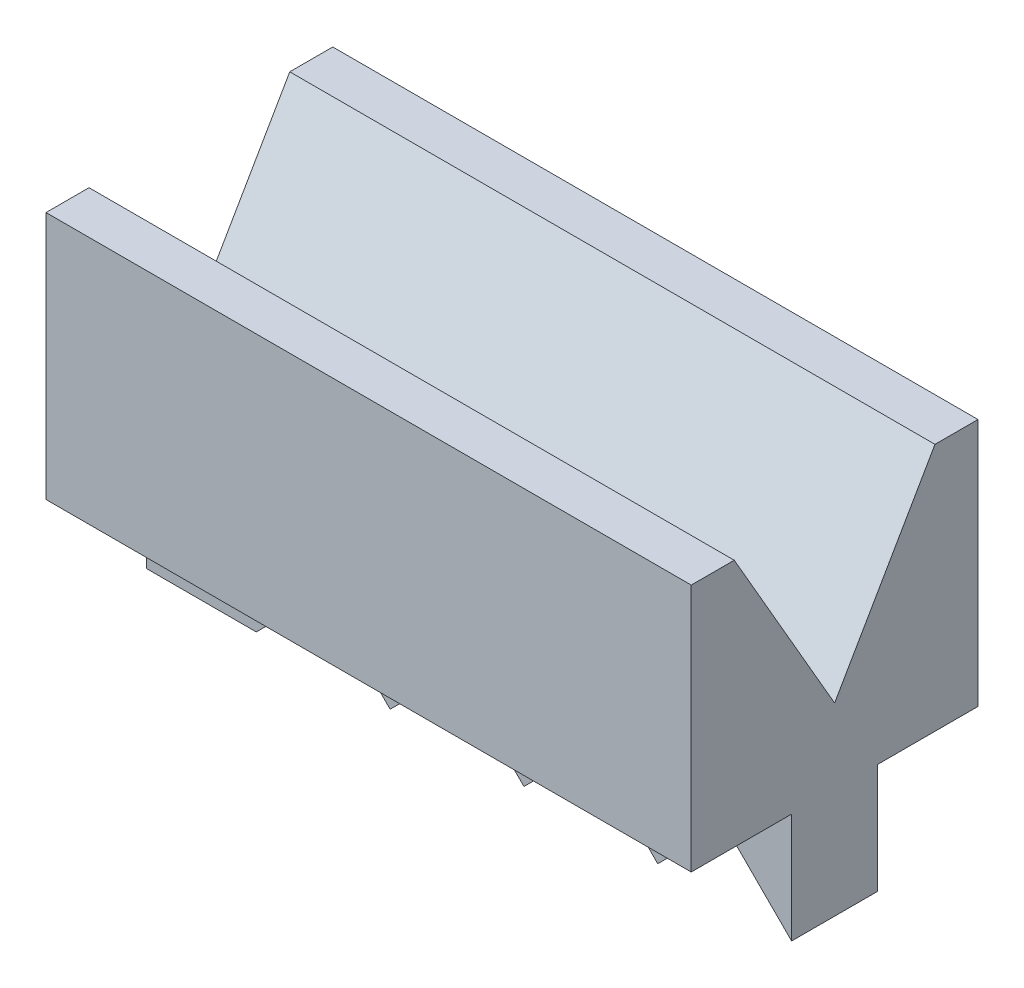
ISO-10303-21;
HEADER;
FILE_DESCRIPTION(('STEP AP214'),'2;1');
FILE_NAME('part.step','',(''),(''),'','','');
FILE_SCHEMA(('AUTOMOTIVE_DESIGN { 1 0 10303 214 1 1 1 1 }'));
ENDSEC;
DATA;
#1=APPLICATION_CONTEXT('core data for automotive mechanical design processes');
#2=APPLICATION_PROTOCOL_DEFINITION('international standard','automotive_design',2000,#1);
#3=PRODUCT_CONTEXT('',#1,'mechanical');
#4=PRODUCT('Part','Part','',(#3));
#5=PRODUCT_RELATED_PRODUCT_CATEGORY('part','',(#4));
#6=PRODUCT_DEFINITION_FORMATION('','',#4);
#7=PRODUCT_DEFINITION_CONTEXT('part definition',#1,'design');
#8=PRODUCT_DEFINITION('design','',#6,#7);
#9=PRODUCT_DEFINITION_SHAPE('','',#8);
#10=(LENGTH_UNIT() NAMED_UNIT(*) SI_UNIT(.MILLI.,.METRE.));
#11=(NAMED_UNIT(*) PLANE_ANGLE_UNIT() SI_UNIT($,.RADIAN.));
#12=(NAMED_UNIT(*) SI_UNIT($,.STERADIAN.) SOLID_ANGLE_UNIT());
#13=UNCERTAINTY_MEASURE_WITH_UNIT(LENGTH_MEASURE(1.E-05),#10,'distance_accuracy_value','');
#14=(GEOMETRIC_REPRESENTATION_CONTEXT(3) GLOBAL_UNCERTAINTY_ASSIGNED_CONTEXT((#13)) GLOBAL_UNIT_ASSIGNED_CONTEXT((#10,
#11,#12)) REPRESENTATION_CONTEXT('',''));
#15=CARTESIAN_POINT('',(0.,0.,0.));
#16=DIRECTION('',(0.,0.,1.));
#17=DIRECTION('',(1.,0.,0.));
#18=AXIS2_PLACEMENT_3D('',#15,#16,#17);
#19=CARTESIAN_POINT('',(135.,-23.,-9.));
#20=DIRECTION('',(0.,1.,0.));
#21=DIRECTION('',(0.,0.,1.));
#22=AXIS2_PLACEMENT_3D('',#19,#20,#21);
#23=PLANE('',#22);
#24=DIRECTION('',(0.,0.,-1.));
#25=VECTOR('',#24,1.);
#26=CARTESIAN_POINT('',(23.,-23.,30.001));
#27=LINE('',#26,#25);
#28=CARTESIAN_POINT('',(23.,-23.,9.));
#29=VERTEX_POINT('',#28);
#30=CARTESIAN_POINT('',(23.,-23.,-9.));
#31=VERTEX_POINT('',#30);
#32=EDGE_CURVE('E230',#29,#31,#27,.T.);
#33=ORIENTED_EDGE('',*,*,#32,.F.);
#34=DIRECTION('',(-1.,0.,0.));
#35=VECTOR('',#34,1.);
#36=CARTESIAN_POINT('',(135.,-23.,9.));
#37=LINE('',#36,#35);
#38=CARTESIAN_POINT('',(0.,-23.,9.));
#39=VERTEX_POINT('',#38);
#40=EDGE_CURVE('E12',#29,#39,#37,.T.);
#41=ORIENTED_EDGE('',*,*,#40,.T.);
#42=DIRECTION('',(0.,0.,-1.));
#43=VECTOR('',#42,1.);
#44=CARTESIAN_POINT('',(0.,-23.,-9.));
#45=LINE('',#44,#43);
#46=CARTESIAN_POINT('',(0.,-23.,-9.));
#47=VERTEX_POINT('',#46);
#48=EDGE_CURVE('E246',#39,#47,#45,.T.);
#49=ORIENTED_EDGE('',*,*,#48,.T.);
#50=DIRECTION('',(-1.,0.,0.));
#51=VECTOR('',#50,1.);
#52=CARTESIAN_POINT('',(135.,-23.,-9.));
#53=LINE('',#52,#51);
#54=EDGE_CURVE('E105',#31,#47,#53,.T.);
#55=ORIENTED_EDGE('',*,*,#54,.F.);
#56=EDGE_LOOP('',(#33,#41,#49,#55));
#57=FACE_BOUND('',#56,.T.);
#58=ADVANCED_FACE('F92',(#57),#23,.F.);
#59=CARTESIAN_POINT('',(135.,-23.,9.));
#60=DIRECTION('',(0.,0.,-1.));
#61=DIRECTION('',(0.,1.,0.));
#62=AXIS2_PLACEMENT_3D('',#59,#60,#61);
#63=PLANE('',#62);
#64=ORIENTED_EDGE('',*,*,#40,.F.);
#65=DIRECTION('',(0.707106781186547,0.707106781186548,0.));
#66=VECTOR('',#65,1.);
#67=CARTESIAN_POINT('',(23.,-23.,9.));
#68=LINE('',#67,#66);
#69=CARTESIAN_POINT('',(37.,-8.99999999999999,9.00000000000001));
#70=VERTEX_POINT('',#69);
#71=EDGE_CURVE('E222',#29,#70,#68,.T.);
#72=ORIENTED_EDGE('',*,*,#71,.T.);
#73=DIRECTION('',(0.707106781186548,-0.707106781186547,0.));
#74=VECTOR('',#73,1.);
#75=CARTESIAN_POINT('',(14.,14.,9.00000000000001));
#76=LINE('',#75,#74);
#77=CARTESIAN_POINT('',(51.,-23.,9.));
#78=VERTEX_POINT('',#77);
#79=EDGE_CURVE('E240',#70,#78,#76,.T.);
#80=ORIENTED_EDGE('',*,*,#79,.T.);
#81=DIRECTION('',(0.707106781186547,0.707106781186548,0.));
#82=VECTOR('',#81,1.);
#83=CARTESIAN_POINT('',(37.,-37.,9.));
#84=LINE('',#83,#82);
#85=CARTESIAN_POINT('',(65.,-8.99999999999999,9.00000000000001));
#86=VERTEX_POINT('',#85);
#87=EDGE_CURVE('E379',#78,#86,#84,.T.);
#88=ORIENTED_EDGE('',*,*,#87,.T.);
#89=DIRECTION('',(0.707106781186548,-0.707106781186547,0.));
#90=VECTOR('',#89,1.);
#91=CARTESIAN_POINT('',(28.,28.,9.00000000000001));
#92=LINE('',#91,#90);
#93=CARTESIAN_POINT('',(79.,-23.,9.));
#94=VERTEX_POINT('',#93);
#95=EDGE_CURVE('E249',#86,#94,#92,.T.);
#96=ORIENTED_EDGE('',*,*,#95,.T.);
#97=DIRECTION('',(0.707106781186547,0.707106781186548,0.));
#98=VECTOR('',#97,1.);
#99=CARTESIAN_POINT('',(51.,-51.,8.99999999999999));
#100=LINE('',#99,#98);
#101=CARTESIAN_POINT('',(93.,-8.99999999999998,9.00000000000001));
#102=VERTEX_POINT('',#101);
#103=EDGE_CURVE('E391',#94,#102,#100,.T.);
#104=ORIENTED_EDGE('',*,*,#103,.T.);
#105=DIRECTION('',(0.707106781186548,-0.707106781186547,0.));
#106=VECTOR('',#105,1.);
#107=CARTESIAN_POINT('',(42.,42.,9.00000000000002));
#108=LINE('',#107,#106);
#109=CARTESIAN_POINT('',(107.,-23.,9.));
#110=VERTEX_POINT('',#109);
#111=EDGE_CURVE('E364',#102,#110,#108,.T.);
#112=ORIENTED_EDGE('',*,*,#111,.T.);
#113=DIRECTION('',(0.707106781186547,0.707106781186548,0.));
#114=VECTOR('',#113,1.);
#115=CARTESIAN_POINT('',(65.0000000000001,-65.,8.99999999999999));
#116=LINE('',#115,#114);
#117=CARTESIAN_POINT('',(121.,-8.99999999999999,9.00000000000001));
#118=VERTEX_POINT('',#117);
#119=EDGE_CURVE('E365',#110,#118,#116,.T.);
#120=ORIENTED_EDGE('',*,*,#119,.T.);
#121=DIRECTION('',(0.707106781186548,-0.707106781186547,0.));
#122=VECTOR('',#121,1.);
#123=CARTESIAN_POINT('',(56.,56.,9.00000000000002));
#124=LINE('',#123,#122);
#125=CARTESIAN_POINT('',(135.,-23.,9.00000000000001));
#126=VERTEX_POINT('',#125);
#127=EDGE_CURVE('E348',#118,#126,#124,.T.);
#128=ORIENTED_EDGE('',*,*,#127,.T.);
#129=DIRECTION('',(0.,-1.,0.));
#130=VECTOR('',#129,1.);
#131=CARTESIAN_POINT('',(135.,-23.,9.));
#132=LINE('',#131,#130);
#133=CARTESIAN_POINT('',(135.,0.,9.00000000000001));
#134=VERTEX_POINT('',#133);
#135=EDGE_CURVE('E280',#134,#126,#132,.T.);
#136=ORIENTED_EDGE('',*,*,#135,.F.);
#137=DIRECTION('',(-1.,0.,0.));
#138=VECTOR('',#137,1.);
#139=CARTESIAN_POINT('',(135.,0.,9.00000000000001));
#140=LINE('',#139,#138);
#141=CARTESIAN_POINT('',(0.,0.,9.00000000000001));
#142=VERTEX_POINT('',#141);
#143=EDGE_CURVE('E244',#134,#142,#140,.T.);
#144=ORIENTED_EDGE('',*,*,#143,.T.);
#145=DIRECTION('',(0.,-1.,0.));
#146=VECTOR('',#145,1.);
#147=CARTESIAN_POINT('',(0.,-23.,9.));
#148=LINE('',#147,#146);
#149=EDGE_CURVE('E245',#142,#39,#148,.T.);
#150=ORIENTED_EDGE('',*,*,#149,.T.);
#151=EDGE_LOOP('',(#64,#72,#80,#88,#96,#104,#112,#120,#128,#136,#144,#150));
#152=FACE_BOUND('',#151,.T.);
#153=ADVANCED_FACE('F96',(#152),#63,.F.);
#154=CARTESIAN_POINT('',(135.,-23.,-9.));
#155=DIRECTION('',(0.,0.,1.));
#156=DIRECTION('',(0.,-1.,0.));
#157=AXIS2_PLACEMENT_3D('',#154,#155,#156);
#158=PLANE('',#157);
#159=DIRECTION('',(-0.707106781186548,0.707106781186547,0.));
#160=VECTOR('',#159,1.);
#161=CARTESIAN_POINT('',(14.,14.,-9.00000000000001));
#162=LINE('',#161,#160);
#163=CARTESIAN_POINT('',(51.,-23.,-9.));
#164=VERTEX_POINT('',#163);
#165=CARTESIAN_POINT('',(37.,-8.99999999999999,-9.00000000000001));
#166=VERTEX_POINT('',#165);
#167=EDGE_CURVE('E400',#164,#166,#162,.T.);
#168=ORIENTED_EDGE('',*,*,#167,.T.);
#169=DIRECTION('',(-0.707106781186547,-0.707106781186548,0.));
#170=VECTOR('',#169,1.);
#171=CARTESIAN_POINT('',(23.,-23.,-9.));
#172=LINE('',#171,#170);
#173=EDGE_CURVE('E107',#166,#31,#172,.T.);
#174=ORIENTED_EDGE('',*,*,#173,.T.);
#175=ORIENTED_EDGE('',*,*,#54,.T.);
#176=DIRECTION('',(0.,1.,0.));
#177=VECTOR('',#176,1.);
#178=CARTESIAN_POINT('',(0.,-23.,-9.));
#179=LINE('',#178,#177);
#180=CARTESIAN_POINT('',(0.,0.,-9.00000000000001));
#181=VERTEX_POINT('',#180);
#182=EDGE_CURVE('E253',#47,#181,#179,.T.);
#183=ORIENTED_EDGE('',*,*,#182,.T.);
#184=DIRECTION('',(-1.,0.,0.));
#185=VECTOR('',#184,1.);
#186=CARTESIAN_POINT('',(135.,0.,-9.00000000000001));
#187=LINE('',#186,#185);
#188=CARTESIAN_POINT('',(135.,0.,-9.00000000000001));
#189=VERTEX_POINT('',#188);
#190=EDGE_CURVE('E299',#189,#181,#187,.T.);
#191=ORIENTED_EDGE('',*,*,#190,.F.);
#192=DIRECTION('',(0.,1.,0.));
#193=VECTOR('',#192,1.);
#194=CARTESIAN_POINT('',(135.,-23.,-9.));
#195=LINE('',#194,#193);
#196=CARTESIAN_POINT('',(135.,-23.,-9.));
#197=VERTEX_POINT('',#196);
#198=EDGE_CURVE('E330',#197,#189,#195,.T.);
#199=ORIENTED_EDGE('',*,*,#198,.F.);
#200=DIRECTION('',(-0.707106781186548,0.707106781186547,0.));
#201=VECTOR('',#200,1.);
#202=CARTESIAN_POINT('',(56.,56.,-9.00000000000002));
#203=LINE('',#202,#201);
#204=CARTESIAN_POINT('',(121.,-8.99999999999999,-9.00000000000001));
#205=VERTEX_POINT('',#204);
#206=EDGE_CURVE('E352',#197,#205,#203,.T.);
#207=ORIENTED_EDGE('',*,*,#206,.T.);
#208=DIRECTION('',(-0.707106781186547,-0.707106781186548,0.));
#209=VECTOR('',#208,1.);
#210=CARTESIAN_POINT('',(65.0000000000001,-65.,-8.99999999999999));
#211=LINE('',#210,#209);
#212=CARTESIAN_POINT('',(107.,-23.,-9.));
#213=VERTEX_POINT('',#212);
#214=EDGE_CURVE('E360',#205,#213,#211,.T.);
#215=ORIENTED_EDGE('',*,*,#214,.T.);
#216=DIRECTION('',(-0.707106781186548,0.707106781186547,0.));
#217=VECTOR('',#216,1.);
#218=CARTESIAN_POINT('',(42.,42.,-9.00000000000002));
#219=LINE('',#218,#217);
#220=CARTESIAN_POINT('',(93.,-8.99999999999999,-9.00000000000001));
#221=VERTEX_POINT('',#220);
#222=EDGE_CURVE('E386',#213,#221,#219,.T.);
#223=ORIENTED_EDGE('',*,*,#222,.T.);
#224=DIRECTION('',(-0.707106781186547,-0.707106781186548,0.));
#225=VECTOR('',#224,1.);
#226=CARTESIAN_POINT('',(51.,-51.,-8.99999999999999));
#227=LINE('',#226,#225);
#228=CARTESIAN_POINT('',(79.,-23.,-9.));
#229=VERTEX_POINT('',#228);
#230=EDGE_CURVE('E120',#221,#229,#227,.T.);
#231=ORIENTED_EDGE('',*,*,#230,.T.);
#232=DIRECTION('',(-0.707106781186548,0.707106781186547,0.));
#233=VECTOR('',#232,1.);
#234=CARTESIAN_POINT('',(28.,28.,-9.00000000000002));
#235=LINE('',#234,#233);
#236=CARTESIAN_POINT('',(65.,-9.,-9.00000000000001));
#237=VERTEX_POINT('',#236);
#238=EDGE_CURVE('E372',#229,#237,#235,.T.);
#239=ORIENTED_EDGE('',*,*,#238,.T.);
#240=DIRECTION('',(-0.707106781186547,-0.707106781186548,0.));
#241=VECTOR('',#240,1.);
#242=CARTESIAN_POINT('',(37.,-37.,-9.));
#243=LINE('',#242,#241);
#244=EDGE_CURVE('E380',#237,#164,#243,.T.);
#245=ORIENTED_EDGE('',*,*,#244,.T.);
#246=EDGE_LOOP('',(#168,#174,#175,#183,#191,#199,#207,#215,#223,#231,#239,#245));
#247=FACE_BOUND('',#246,.T.);
#248=ADVANCED_FACE('F305',(#247),#158,.F.);
#249=CARTESIAN_POINT('',(135.,0.,-9.00000000000001));
#250=DIRECTION('',(0.,1.,0.));
#251=DIRECTION('',(0.,0.,1.));
#252=AXIS2_PLACEMENT_3D('',#249,#250,#251);
#253=PLANE('',#252);
#254=DIRECTION('',(0.,0.,-1.));
#255=VECTOR('',#254,1.);
#256=CARTESIAN_POINT('',(0.,0.,-9.00000000000001));
#257=LINE('',#256,#255);
#258=CARTESIAN_POINT('',(0.,0.,-30.));
#259=VERTEX_POINT('',#258);
#260=EDGE_CURVE('E263',#181,#259,#257,.T.);
#261=ORIENTED_EDGE('',*,*,#260,.T.);
#262=DIRECTION('',(-1.,0.,0.));
#263=VECTOR('',#262,1.);
#264=CARTESIAN_POINT('',(135.,0.,-30.));
#265=LINE('',#264,#263);
#266=CARTESIAN_POINT('',(135.,0.,-30.));
#267=VERTEX_POINT('',#266);
#268=EDGE_CURVE('E300',#267,#259,#265,.T.);
#269=ORIENTED_EDGE('',*,*,#268,.F.);
#270=DIRECTION('',(0.,0.,-1.));
#271=VECTOR('',#270,1.);
#272=CARTESIAN_POINT('',(135.,0.,-9.00000000000001));
#273=LINE('',#272,#271);
#274=EDGE_CURVE('E322',#189,#267,#273,.T.);
#275=ORIENTED_EDGE('',*,*,#274,.F.);
#276=ORIENTED_EDGE('',*,*,#190,.T.);
#277=EDGE_LOOP('',(#261,#269,#275,#276));
#278=FACE_BOUND('',#277,.T.);
#279=ADVANCED_FACE('F313',(#278),#253,.F.);
#280=CARTESIAN_POINT('',(135.,0.,-30.));
#281=DIRECTION('',(0.,0.,1.));
#282=DIRECTION('',(0.,-1.,0.));
#283=AXIS2_PLACEMENT_3D('',#280,#281,#282);
#284=PLANE('',#283);
#285=DIRECTION('',(0.,1.,0.));
#286=VECTOR('',#285,1.);
#287=CARTESIAN_POINT('',(0.,0.,-30.));
#288=LINE('',#287,#286);
#289=CARTESIAN_POINT('',(0.,52.,-30.));
#290=VERTEX_POINT('',#289);
#291=EDGE_CURVE('E261',#259,#290,#288,.T.);
#292=ORIENTED_EDGE('',*,*,#291,.T.);
#293=DIRECTION('',(-1.,0.,0.));
#294=VECTOR('',#293,1.);
#295=CARTESIAN_POINT('',(135.,52.,-30.));
#296=LINE('',#295,#294);
#297=CARTESIAN_POINT('',(135.,52.,-30.));
#298=VERTEX_POINT('',#297);
#299=EDGE_CURVE('E294',#298,#290,#296,.T.);
#300=ORIENTED_EDGE('',*,*,#299,.F.);
#301=DIRECTION('',(0.,1.,0.));
#302=VECTOR('',#301,1.);
#303=CARTESIAN_POINT('',(135.,0.,-30.));
#304=LINE('',#303,#302);
#305=EDGE_CURVE('E317',#267,#298,#304,.T.);
#306=ORIENTED_EDGE('',*,*,#305,.F.);
#307=ORIENTED_EDGE('',*,*,#268,.T.);
#308=EDGE_LOOP('',(#292,#300,#306,#307));
#309=FACE_BOUND('',#308,.T.);
#310=ADVANCED_FACE('F320',(#309),#284,.F.);
#311=CARTESIAN_POINT('',(135.,52.,-30.));
#312=DIRECTION('',(0.,-1.,0.));
#313=DIRECTION('',(0.,0.,-1.));
#314=AXIS2_PLACEMENT_3D('',#311,#312,#313);
#315=PLANE('',#314);
#316=DIRECTION('',(0.,0.,1.));
#317=VECTOR('',#316,1.);
#318=CARTESIAN_POINT('',(0.,52.,-30.));
#319=LINE('',#318,#317);
#320=CARTESIAN_POINT('',(0.,52.,-21.));
#321=VERTEX_POINT('',#320);
#322=EDGE_CURVE('E262',#290,#321,#319,.T.);
#323=ORIENTED_EDGE('',*,*,#322,.T.);
#324=DIRECTION('',(-1.,0.,0.));
#325=VECTOR('',#324,1.);
#326=CARTESIAN_POINT('',(135.,52.,-21.));
#327=LINE('',#326,#325);
#328=CARTESIAN_POINT('',(135.,52.,-21.));
#329=VERTEX_POINT('',#328);
#330=EDGE_CURVE('E292',#329,#321,#327,.T.);
#331=ORIENTED_EDGE('',*,*,#330,.F.);
#332=DIRECTION('',(0.,0.,1.));
#333=VECTOR('',#332,1.);
#334=CARTESIAN_POINT('',(135.,52.,-30.));
#335=LINE('',#334,#333);
#336=EDGE_CURVE('E325',#298,#329,#335,.T.);
#337=ORIENTED_EDGE('',*,*,#336,.F.);
#338=ORIENTED_EDGE('',*,*,#299,.T.);
#339=EDGE_LOOP('',(#323,#331,#337,#338));
#340=FACE_BOUND('',#339,.T.);
#341=ADVANCED_FACE('F436',(#340),#315,.F.);
#342=CARTESIAN_POINT('',(135.,52.,-21.));
#343=DIRECTION('',(0.,-0.499999999999995,-0.866025403784441));
#344=DIRECTION('',(0.,0.866025403784441,-0.499999999999995));
#345=AXIS2_PLACEMENT_3D('',#342,#343,#344);
#346=PLANE('',#345);
#347=DIRECTION('',(0.,-0.866025403784441,0.499999999999995));
#348=VECTOR('',#347,1.);
#349=CARTESIAN_POINT('',(0.,52.,-21.));
#350=LINE('',#349,#348);
#351=CARTESIAN_POINT('',(0.,15.6269330410531,0.));
#352=VERTEX_POINT('',#351);
#353=EDGE_CURVE('E270',#321,#352,#350,.T.);
#354=ORIENTED_EDGE('',*,*,#353,.T.);
#355=DIRECTION('',(-1.,0.,0.));
#356=VECTOR('',#355,1.);
#357=CARTESIAN_POINT('',(135.,15.6269330410531,0.));
#358=LINE('',#357,#356);
#359=CARTESIAN_POINT('',(135.,15.6269330410531,0.));
#360=VERTEX_POINT('',#359);
#361=EDGE_CURVE('E286',#360,#352,#358,.T.);
#362=ORIENTED_EDGE('',*,*,#361,.F.);
#363=DIRECTION('',(0.,-0.866025403784441,0.499999999999995));
#364=VECTOR('',#363,1.);
#365=CARTESIAN_POINT('',(135.,52.,-21.));
#366=LINE('',#365,#364);
#367=EDGE_CURVE('E324',#329,#360,#366,.T.);
#368=ORIENTED_EDGE('',*,*,#367,.F.);
#369=ORIENTED_EDGE('',*,*,#330,.T.);
#370=EDGE_LOOP('',(#354,#362,#368,#369));
#371=FACE_BOUND('',#370,.T.);
#372=ADVANCED_FACE('F443',(#371),#346,.F.);
#373=CARTESIAN_POINT('',(135.,52.,21.));
#374=DIRECTION('',(0.,-0.499999999999995,0.866025403784441));
#375=DIRECTION('',(0.,-0.866025403784441,-0.499999999999995));
#376=AXIS2_PLACEMENT_3D('',#373,#374,#375);
#377=PLANE('',#376);
#378=DIRECTION('',(0.,0.866025403784441,0.499999999999995));
#379=VECTOR('',#378,1.);
#380=CARTESIAN_POINT('',(0.,52.,21.));
#381=LINE('',#380,#379);
#382=CARTESIAN_POINT('',(0.,52.,21.));
#383=VERTEX_POINT('',#382);
#384=EDGE_CURVE('E267',#352,#383,#381,.T.);
#385=ORIENTED_EDGE('',*,*,#384,.T.);
#386=DIRECTION('',(-1.,0.,0.));
#387=VECTOR('',#386,1.);
#388=CARTESIAN_POINT('',(135.,52.,21.));
#389=LINE('',#388,#387);
#390=CARTESIAN_POINT('',(135.,52.,21.));
#391=VERTEX_POINT('',#390);
#392=EDGE_CURVE('E283',#391,#383,#389,.T.);
#393=ORIENTED_EDGE('',*,*,#392,.F.);
#394=DIRECTION('',(0.,0.866025403784441,0.499999999999995));
#395=VECTOR('',#394,1.);
#396=CARTESIAN_POINT('',(135.,52.,21.));
#397=LINE('',#396,#395);
#398=EDGE_CURVE('E335',#360,#391,#397,.T.);
#399=ORIENTED_EDGE('',*,*,#398,.F.);
#400=ORIENTED_EDGE('',*,*,#361,.T.);
#401=EDGE_LOOP('',(#385,#393,#399,#400));
#402=FACE_BOUND('',#401,.T.);
#403=ADVANCED_FACE('F442',(#402),#377,.F.);
#404=CARTESIAN_POINT('',(135.,52.,30.));
#405=DIRECTION('',(0.,-1.,0.));
#406=DIRECTION('',(0.,0.,-1.));
#407=AXIS2_PLACEMENT_3D('',#404,#405,#406);
#408=PLANE('',#407);
#409=DIRECTION('',(0.,0.,1.));
#410=VECTOR('',#409,1.);
#411=CARTESIAN_POINT('',(0.,52.,30.));
#412=LINE('',#411,#410);
#413=CARTESIAN_POINT('',(0.,52.,30.));
#414=VERTEX_POINT('',#413);
#415=EDGE_CURVE('E271',#383,#414,#412,.T.);
#416=ORIENTED_EDGE('',*,*,#415,.T.);
#417=DIRECTION('',(-1.,0.,0.));
#418=VECTOR('',#417,1.);
#419=CARTESIAN_POINT('',(135.,52.,30.));
#420=LINE('',#419,#418);
#421=CARTESIAN_POINT('',(135.,52.,30.));
#422=VERTEX_POINT('',#421);
#423=EDGE_CURVE('E285',#422,#414,#420,.T.);
#424=ORIENTED_EDGE('',*,*,#423,.F.);
#425=DIRECTION('',(0.,0.,1.));
#426=VECTOR('',#425,1.);
#427=CARTESIAN_POINT('',(135.,52.,30.));
#428=LINE('',#427,#426);
#429=EDGE_CURVE('E332',#391,#422,#428,.T.);
#430=ORIENTED_EDGE('',*,*,#429,.F.);
#431=ORIENTED_EDGE('',*,*,#392,.T.);
#432=EDGE_LOOP('',(#416,#424,#430,#431));
#433=FACE_BOUND('',#432,.T.);
#434=ADVANCED_FACE('F447',(#433),#408,.F.);
#435=CARTESIAN_POINT('',(135.,0.,30.));
#436=DIRECTION('',(0.,0.,-1.));
#437=DIRECTION('',(0.,1.,0.));
#438=AXIS2_PLACEMENT_3D('',#435,#436,#437);
#439=PLANE('',#438);
#440=DIRECTION('',(0.,-1.,0.));
#441=VECTOR('',#440,1.);
#442=CARTESIAN_POINT('',(0.,0.,30.));
#443=LINE('',#442,#441);
#444=CARTESIAN_POINT('',(0.,0.,30.));
#445=VERTEX_POINT('',#444);
#446=EDGE_CURVE('E273',#414,#445,#443,.T.);
#447=ORIENTED_EDGE('',*,*,#446,.T.);
#448=DIRECTION('',(-1.,0.,0.));
#449=VECTOR('',#448,1.);
#450=CARTESIAN_POINT('',(135.,0.,30.));
#451=LINE('',#450,#449);
#452=CARTESIAN_POINT('',(135.,0.,30.));
#453=VERTEX_POINT('',#452);
#454=EDGE_CURVE('E278',#453,#445,#451,.T.);
#455=ORIENTED_EDGE('',*,*,#454,.F.);
#456=DIRECTION('',(0.,-1.,0.));
#457=VECTOR('',#456,1.);
#458=CARTESIAN_POINT('',(135.,0.,30.));
#459=LINE('',#458,#457);
#460=EDGE_CURVE('E334',#422,#453,#459,.T.);
#461=ORIENTED_EDGE('',*,*,#460,.F.);
#462=ORIENTED_EDGE('',*,*,#423,.T.);
#463=EDGE_LOOP('',(#447,#455,#461,#462));
#464=FACE_BOUND('',#463,.T.);
#465=ADVANCED_FACE('F453',(#464),#439,.F.);
#466=CARTESIAN_POINT('',(135.,0.,9.00000000000001));
#467=DIRECTION('',(0.,1.,0.));
#468=DIRECTION('',(0.,0.,1.));
#469=AXIS2_PLACEMENT_3D('',#466,#467,#468);
#470=PLANE('',#469);
#471=DIRECTION('',(0.,0.,-1.));
#472=VECTOR('',#471,1.);
#473=CARTESIAN_POINT('',(0.,0.,9.00000000000001));
#474=LINE('',#473,#472);
#475=EDGE_CURVE('E274',#445,#142,#474,.T.);
#476=ORIENTED_EDGE('',*,*,#475,.T.);
#477=ORIENTED_EDGE('',*,*,#143,.F.);
#478=DIRECTION('',(0.,0.,-1.));
#479=VECTOR('',#478,1.);
#480=CARTESIAN_POINT('',(135.,0.,9.00000000000001));
#481=LINE('',#480,#479);
#482=EDGE_CURVE('E257',#453,#134,#481,.T.);
#483=ORIENTED_EDGE('',*,*,#482,.F.);
#484=ORIENTED_EDGE('',*,*,#454,.T.);
#485=EDGE_LOOP('',(#476,#477,#483,#484));
#486=FACE_BOUND('',#485,.T.);
#487=ADVANCED_FACE('F341',(#486),#470,.F.);
#488=CARTESIAN_POINT('',(135.,0.,0.));
#489=DIRECTION('',(1.,0.,0.));
#490=DIRECTION('',(0.,0.,-1.));
#491=AXIS2_PLACEMENT_3D('',#488,#489,#490);
#492=PLANE('',#491);
#493=ORIENTED_EDGE('',*,*,#135,.T.);
#494=DIRECTION('',(0.,0.,-1.));
#495=VECTOR('',#494,1.);
#496=CARTESIAN_POINT('',(135.,-23.,-9.));
#497=LINE('',#496,#495);
#498=EDGE_CURVE('E347',#126,#197,#497,.T.);
#499=ORIENTED_EDGE('',*,*,#498,.T.);
#500=ORIENTED_EDGE('',*,*,#198,.T.);
#501=ORIENTED_EDGE('',*,*,#274,.T.);
#502=ORIENTED_EDGE('',*,*,#305,.T.);
#503=ORIENTED_EDGE('',*,*,#336,.T.);
#504=ORIENTED_EDGE('',*,*,#367,.T.);
#505=ORIENTED_EDGE('',*,*,#398,.T.);
#506=ORIENTED_EDGE('',*,*,#429,.T.);
#507=ORIENTED_EDGE('',*,*,#460,.T.);
#508=ORIENTED_EDGE('',*,*,#482,.T.);
#509=EDGE_LOOP('',(#493,#499,#500,#501,#502,#503,#504,#505,#506,#507,#508));
#510=FACE_BOUND('',#509,.T.);
#511=ADVANCED_FACE('F338',(#510),#492,.T.);
#512=CARTESIAN_POINT('',(0.,0.,0.));
#513=DIRECTION('',(1.,0.,0.));
#514=DIRECTION('',(0.,0.,-1.));
#515=AXIS2_PLACEMENT_3D('',#512,#513,#514);
#516=PLANE('',#515);
#517=ORIENTED_EDGE('',*,*,#149,.F.);
#518=ORIENTED_EDGE('',*,*,#475,.F.);
#519=ORIENTED_EDGE('',*,*,#446,.F.);
#520=ORIENTED_EDGE('',*,*,#415,.F.);
#521=ORIENTED_EDGE('',*,*,#384,.F.);
#522=ORIENTED_EDGE('',*,*,#353,.F.);
#523=ORIENTED_EDGE('',*,*,#322,.F.);
#524=ORIENTED_EDGE('',*,*,#291,.F.);
#525=ORIENTED_EDGE('',*,*,#260,.F.);
#526=ORIENTED_EDGE('',*,*,#182,.F.);
#527=ORIENTED_EDGE('',*,*,#48,.F.);
#528=EDGE_LOOP('',(#517,#518,#519,#520,#521,#522,#523,#524,#525,#526,#527));
#529=FACE_BOUND('',#528,.T.);
#530=ADVANCED_FACE('F306',(#529),#516,.F.);
#531=CARTESIAN_POINT('',(65.0000000000001,-65.,30.0010000000001));
#532=DIRECTION('',(0.707106781186548,-0.707106781186547,0.));
#533=DIRECTION('',(0.707106781186547,0.707106781186548,0.));
#534=AXIS2_PLACEMENT_3D('',#531,#532,#533);
#535=PLANE('',#534);
#536=DIRECTION('',(0.,0.,-1.));
#537=VECTOR('',#536,1.);
#538=CARTESIAN_POINT('',(107.,-23.,30.001));
#539=LINE('',#538,#537);
#540=EDGE_CURVE('E383',#110,#213,#539,.T.);
#541=ORIENTED_EDGE('',*,*,#540,.T.);
#542=ORIENTED_EDGE('',*,*,#214,.F.);
#543=DIRECTION('',(0.,0.,-1.));
#544=VECTOR('',#543,1.);
#545=CARTESIAN_POINT('',(121.,-8.99999999999998,30.001));
#546=LINE('',#545,#544);
#547=EDGE_CURVE('E359',#118,#205,#546,.T.);
#548=ORIENTED_EDGE('',*,*,#547,.F.);
#549=ORIENTED_EDGE('',*,*,#119,.F.);
#550=EDGE_LOOP('',(#541,#542,#548,#549));
#551=FACE_BOUND('',#550,.T.);
#552=ADVANCED_FACE('F414',(#551),#535,.T.);
#553=CARTESIAN_POINT('',(56.,56.,30.001));
#554=DIRECTION('',(-0.707106781186547,-0.707106781186548,0.));
#555=DIRECTION('',(0.707106781186548,-0.707106781186547,0.));
#556=AXIS2_PLACEMENT_3D('',#553,#554,#555);
#557=PLANE('',#556);
#558=ORIENTED_EDGE('',*,*,#547,.T.);
#559=ORIENTED_EDGE('',*,*,#206,.F.);
#560=ORIENTED_EDGE('',*,*,#498,.F.);
#561=ORIENTED_EDGE('',*,*,#127,.F.);
#562=EDGE_LOOP('',(#558,#559,#560,#561));
#563=FACE_BOUND('',#562,.T.);
#564=ADVANCED_FACE('F420',(#563),#557,.T.);
#565=CARTESIAN_POINT('',(37.,-37.,30.001));
#566=DIRECTION('',(0.707106781186548,-0.707106781186547,0.));
#567=DIRECTION('',(0.707106781186547,0.707106781186548,0.));
#568=AXIS2_PLACEMENT_3D('',#565,#566,#567);
#569=PLANE('',#568);
#570=DIRECTION('',(0.,0.,-1.));
#571=VECTOR('',#570,1.);
#572=CARTESIAN_POINT('',(51.,-23.,30.001));
#573=LINE('',#572,#571);
#574=EDGE_CURVE('E252',#78,#164,#573,.T.);
#575=ORIENTED_EDGE('',*,*,#574,.T.);
#576=ORIENTED_EDGE('',*,*,#244,.F.);
#577=DIRECTION('',(0.,0.,-1.));
#578=VECTOR('',#577,1.);
#579=CARTESIAN_POINT('',(65.,-8.99999999999999,30.001));
#580=LINE('',#579,#578);
#581=EDGE_CURVE('E370',#86,#237,#580,.T.);
#582=ORIENTED_EDGE('',*,*,#581,.F.);
#583=ORIENTED_EDGE('',*,*,#87,.F.);
#584=EDGE_LOOP('',(#575,#576,#582,#583));
#585=FACE_BOUND('',#584,.T.);
#586=ADVANCED_FACE('F402',(#585),#569,.T.);
#587=CARTESIAN_POINT('',(28.,28.,30.001));
#588=DIRECTION('',(-0.707106781186547,-0.707106781186548,0.));
#589=DIRECTION('',(0.707106781186548,-0.707106781186547,0.));
#590=AXIS2_PLACEMENT_3D('',#587,#588,#589);
#591=PLANE('',#590);
#592=ORIENTED_EDGE('',*,*,#581,.T.);
#593=ORIENTED_EDGE('',*,*,#238,.F.);
#594=DIRECTION('',(0.,0.,-1.));
#595=VECTOR('',#594,1.);
#596=CARTESIAN_POINT('',(79.,-23.,30.001));
#597=LINE('',#596,#595);
#598=EDGE_CURVE('E369',#94,#229,#597,.T.);
#599=ORIENTED_EDGE('',*,*,#598,.F.);
#600=ORIENTED_EDGE('',*,*,#95,.F.);
#601=EDGE_LOOP('',(#592,#593,#599,#600));
#602=FACE_BOUND('',#601,.T.);
#603=ADVANCED_FACE('F408',(#602),#591,.T.);
#604=CARTESIAN_POINT('',(51.,-51.,30.001));
#605=DIRECTION('',(0.707106781186548,-0.707106781186547,0.));
#606=DIRECTION('',(0.707106781186547,0.707106781186548,0.));
#607=AXIS2_PLACEMENT_3D('',#604,#605,#606);
#608=PLANE('',#607);
#609=ORIENTED_EDGE('',*,*,#598,.T.);
#610=ORIENTED_EDGE('',*,*,#230,.F.);
#611=DIRECTION('',(0.,0.,-1.));
#612=VECTOR('',#611,1.);
#613=CARTESIAN_POINT('',(93.,-8.99999999999998,30.001));
#614=LINE('',#613,#612);
#615=EDGE_CURVE('E388',#102,#221,#614,.T.);
#616=ORIENTED_EDGE('',*,*,#615,.F.);
#617=ORIENTED_EDGE('',*,*,#103,.F.);
#618=EDGE_LOOP('',(#609,#610,#616,#617));
#619=FACE_BOUND('',#618,.T.);
#620=ADVANCED_FACE('F409',(#619),#608,.T.);
#621=CARTESIAN_POINT('',(42.,42.,30.001));
#622=DIRECTION('',(-0.707106781186547,-0.707106781186548,0.));
#623=DIRECTION('',(0.707106781186548,-0.707106781186547,0.));
#624=AXIS2_PLACEMENT_3D('',#621,#622,#623);
#625=PLANE('',#624);
#626=ORIENTED_EDGE('',*,*,#615,.T.);
#627=ORIENTED_EDGE('',*,*,#222,.F.);
#628=ORIENTED_EDGE('',*,*,#540,.F.);
#629=ORIENTED_EDGE('',*,*,#111,.F.);
#630=EDGE_LOOP('',(#626,#627,#628,#629));
#631=FACE_BOUND('',#630,.T.);
#632=ADVANCED_FACE('F415',(#631),#625,.T.);
#633=CARTESIAN_POINT('',(23.,-23.,30.001));
#634=DIRECTION('',(0.707106781186548,-0.707106781186547,0.));
#635=DIRECTION('',(0.707106781186547,0.707106781186548,0.));
#636=AXIS2_PLACEMENT_3D('',#633,#634,#635);
#637=PLANE('',#636);
#638=ORIENTED_EDGE('',*,*,#32,.T.);
#639=ORIENTED_EDGE('',*,*,#173,.F.);
#640=DIRECTION('',(0.,0.,-1.));
#641=VECTOR('',#640,1.);
#642=CARTESIAN_POINT('',(37.,-8.99999999999998,30.001));
#643=LINE('',#642,#641);
#644=EDGE_CURVE('E228',#70,#166,#643,.T.);
#645=ORIENTED_EDGE('',*,*,#644,.F.);
#646=ORIENTED_EDGE('',*,*,#71,.F.);
#647=EDGE_LOOP('',(#638,#639,#645,#646));
#648=FACE_BOUND('',#647,.T.);
#649=ADVANCED_FACE('F226',(#648),#637,.T.);
#650=CARTESIAN_POINT('',(14.,14.,30.001));
#651=DIRECTION('',(-0.707106781186547,-0.707106781186548,0.));
#652=DIRECTION('',(0.707106781186548,-0.707106781186547,0.));
#653=AXIS2_PLACEMENT_3D('',#650,#651,#652);
#654=PLANE('',#653);
#655=ORIENTED_EDGE('',*,*,#644,.T.);
#656=ORIENTED_EDGE('',*,*,#167,.F.);
#657=ORIENTED_EDGE('',*,*,#574,.F.);
#658=ORIENTED_EDGE('',*,*,#79,.F.);
#659=EDGE_LOOP('',(#655,#656,#657,#658));
#660=FACE_BOUND('',#659,.T.);
#661=ADVANCED_FACE('F401',(#660),#654,.T.);
#662=CLOSED_SHELL('',(#58,#153,#248,#279,#310,#341,#372,#403,#434,#465,#487,#511,#530,#552,#564,
#586,#603,#620,#632,#649,#661));
#663=MANIFOLD_SOLID_BREP('B2',#662);
#664=ADVANCED_BREP_SHAPE_REPRESENTATION('',(#18,#663),#14);
#665=SHAPE_DEFINITION_REPRESENTATION(#9,#664);
ENDSEC;
END-ISO-10303-21;
